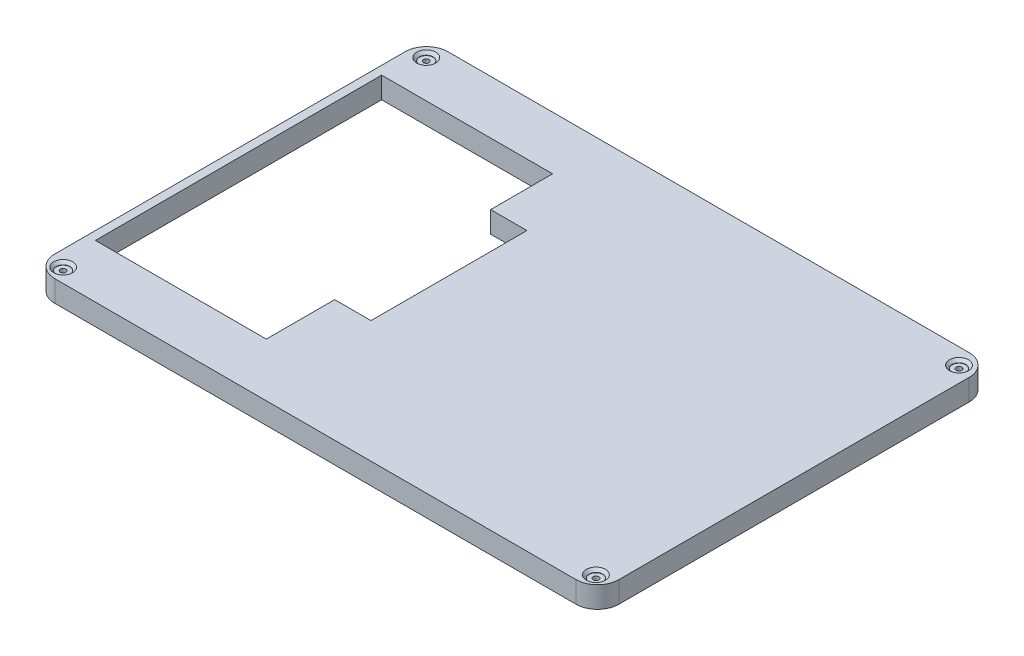
ISO-10303-21;
HEADER;
FILE_DESCRIPTION(('STEP AP214'),'2;1');
FILE_NAME('part.step','',(''),(''),'','','');
FILE_SCHEMA(('AUTOMOTIVE_DESIGN { 1 0 10303 214 1 1 1 1 }'));
ENDSEC;
DATA;
#1=APPLICATION_CONTEXT('core data for automotive mechanical design processes');
#2=APPLICATION_PROTOCOL_DEFINITION('international standard','automotive_design',2000,#1);
#3=PRODUCT_CONTEXT('',#1,'mechanical');
#4=PRODUCT('Part','Part','',(#3));
#5=PRODUCT_RELATED_PRODUCT_CATEGORY('part','',(#4));
#6=PRODUCT_DEFINITION_FORMATION('','',#4);
#7=PRODUCT_DEFINITION_CONTEXT('part definition',#1,'design');
#8=PRODUCT_DEFINITION('design','',#6,#7);
#9=PRODUCT_DEFINITION_SHAPE('','',#8);
#10=(LENGTH_UNIT() NAMED_UNIT(*) SI_UNIT(.MILLI.,.METRE.));
#11=(NAMED_UNIT(*) PLANE_ANGLE_UNIT() SI_UNIT($,.RADIAN.));
#12=(NAMED_UNIT(*) SI_UNIT($,.STERADIAN.) SOLID_ANGLE_UNIT());
#13=UNCERTAINTY_MEASURE_WITH_UNIT(LENGTH_MEASURE(1.E-05),#10,'distance_accuracy_value','');
#14=(GEOMETRIC_REPRESENTATION_CONTEXT(3) GLOBAL_UNCERTAINTY_ASSIGNED_CONTEXT((#13)) GLOBAL_UNIT_ASSIGNED_CONTEXT((#10,
#11,#12)) REPRESENTATION_CONTEXT('',''));
#15=CARTESIAN_POINT('',(0.,0.,0.));
#16=DIRECTION('',(0.,0.,1.));
#17=DIRECTION('',(1.,0.,0.));
#18=AXIS2_PLACEMENT_3D('',#15,#16,#17);
#19=CARTESIAN_POINT('',(-61.,5.,41.));
#20=DIRECTION('',(0.,-1.,0.));
#21=DIRECTION('',(0.,0.,-1.));
#22=AXIS2_PLACEMENT_3D('',#19,#20,#21);
#23=PLANE('',#22);
#24=CARTESIAN_POINT('',(-62.3404075833376,5.,-42.2682833372449));
#25=DIRECTION('',(0.,1.,0.));
#26=DIRECTION('',(0.,0.,1.));
#27=AXIS2_PLACEMENT_3D('',#24,#25,#26);
#28=CIRCLE('',#27,2.2225);
#29=CARTESIAN_POINT('',(-62.3404075833376,5.,-40.0457833372449));
#30=VERTEX_POINT('',#29);
#31=EDGE_CURVE('E489',#30,#30,#28,.T.);
#32=ORIENTED_EDGE('',*,*,#31,.F.);
#33=EDGE_LOOP('',(#32));
#34=FACE_BOUND('',#33,.T.);
#35=CARTESIAN_POINT('',(62.3403524332463,5.,-42.2682833372449));
#36=DIRECTION('',(0.,1.,0.));
#37=DIRECTION('',(0.,0.,1.));
#38=AXIS2_PLACEMENT_3D('',#35,#36,#37);
#39=CIRCLE('',#38,2.2225);
#40=CARTESIAN_POINT('',(62.3403524332463,5.,-40.0457833372449));
#41=VERTEX_POINT('',#40);
#42=EDGE_CURVE('E507',#41,#41,#39,.T.);
#43=ORIENTED_EDGE('',*,*,#42,.F.);
#44=EDGE_LOOP('',(#43));
#45=FACE_BOUND('',#44,.T.);
#46=CARTESIAN_POINT('',(62.3403524332463,5.,42.7012133777981));
#47=DIRECTION('',(0.,1.,0.));
#48=DIRECTION('',(0.,0.,1.));
#49=AXIS2_PLACEMENT_3D('',#46,#47,#48);
#50=CIRCLE('',#49,2.2225);
#51=CARTESIAN_POINT('',(62.3403524332463,5.,44.9237133777981));
#52=VERTEX_POINT('',#51);
#53=EDGE_CURVE('E547',#52,#52,#50,.T.);
#54=ORIENTED_EDGE('',*,*,#53,.F.);
#55=EDGE_LOOP('',(#54));
#56=FACE_BOUND('',#55,.T.);
#57=CARTESIAN_POINT('',(-61.,5.,41.));
#58=DIRECTION('',(0.,1.,0.));
#59=DIRECTION('',(0.,0.,-1.));
#60=AXIS2_PLACEMENT_3D('',#57,#58,#59);
#61=CIRCLE('',#60,5.);
#62=CARTESIAN_POINT('',(-66.,5.,41.));
#63=VERTEX_POINT('',#62);
#64=CARTESIAN_POINT('',(-61.,5.,46.));
#65=VERTEX_POINT('',#64);
#66=EDGE_CURVE('E253',#63,#65,#61,.T.);
#67=ORIENTED_EDGE('',*,*,#66,.T.);
#68=DIRECTION('',(1.,0.,0.));
#69=VECTOR('',#68,1.);
#70=CARTESIAN_POINT('',(-61.,5.,46.));
#71=LINE('',#70,#69);
#72=CARTESIAN_POINT('',(61.,5.,46.));
#73=VERTEX_POINT('',#72);
#74=EDGE_CURVE('E254',#65,#73,#71,.T.);
#75=ORIENTED_EDGE('',*,*,#74,.T.);
#76=CARTESIAN_POINT('',(61.,5.,41.));
#77=DIRECTION('',(0.,1.,0.));
#78=DIRECTION('',(0.,0.,1.));
#79=AXIS2_PLACEMENT_3D('',#76,#77,#78);
#80=CIRCLE('',#79,5.);
#81=CARTESIAN_POINT('',(66.,5.,41.));
#82=VERTEX_POINT('',#81);
#83=EDGE_CURVE('E259',#73,#82,#80,.T.);
#84=ORIENTED_EDGE('',*,*,#83,.T.);
#85=DIRECTION('',(0.,0.,-1.));
#86=VECTOR('',#85,1.);
#87=CARTESIAN_POINT('',(66.,5.,41.));
#88=LINE('',#87,#86);
#89=CARTESIAN_POINT('',(66.,5.,-41.));
#90=VERTEX_POINT('',#89);
#91=EDGE_CURVE('E265',#82,#90,#88,.T.);
#92=ORIENTED_EDGE('',*,*,#91,.T.);
#93=CARTESIAN_POINT('',(61.,5.,-41.));
#94=DIRECTION('',(0.,1.,0.));
#95=DIRECTION('',(0.,0.,-1.));
#96=AXIS2_PLACEMENT_3D('',#93,#94,#95);
#97=CIRCLE('',#96,5.);
#98=CARTESIAN_POINT('',(61.,5.,-46.));
#99=VERTEX_POINT('',#98);
#100=EDGE_CURVE('E264',#90,#99,#97,.T.);
#101=ORIENTED_EDGE('',*,*,#100,.T.);
#102=DIRECTION('',(-1.,0.,0.));
#103=VECTOR('',#102,1.);
#104=CARTESIAN_POINT('',(-61.,5.,-46.));
#105=LINE('',#104,#103);
#106=CARTESIAN_POINT('',(-61.,5.,-46.));
#107=VERTEX_POINT('',#106);
#108=EDGE_CURVE('E268',#99,#107,#105,.T.);
#109=ORIENTED_EDGE('',*,*,#108,.T.);
#110=CARTESIAN_POINT('',(-61.,5.,-41.));
#111=DIRECTION('',(0.,1.,0.));
#112=DIRECTION('',(0.,0.,-1.));
#113=AXIS2_PLACEMENT_3D('',#110,#111,#112);
#114=CIRCLE('',#113,5.);
#115=CARTESIAN_POINT('',(-66.,5.,-41.));
#116=VERTEX_POINT('',#115);
#117=EDGE_CURVE('E271',#107,#116,#114,.T.);
#118=ORIENTED_EDGE('',*,*,#117,.T.);
#119=DIRECTION('',(0.,0.,1.));
#120=VECTOR('',#119,1.);
#121=CARTESIAN_POINT('',(-66.,5.,41.));
#122=LINE('',#121,#120);
#123=EDGE_CURVE('E273',#116,#63,#122,.T.);
#124=ORIENTED_EDGE('',*,*,#123,.T.);
#125=EDGE_LOOP('',(#67,#75,#84,#92,#101,#109,#118,#124));
#126=FACE_BOUND('',#125,.T.);
#127=DIRECTION('',(0.,0.,-1.));
#128=VECTOR('',#127,1.);
#129=CARTESIAN_POINT('',(-24.,5.,-19.));
#130=LINE('',#129,#128);
#131=CARTESIAN_POINT('',(-24.,5.,-19.));
#132=VERTEX_POINT('',#131);
#133=CARTESIAN_POINT('',(-24.,5.,-33.5));
#134=VERTEX_POINT('',#133);
#135=EDGE_CURVE('E157',#132,#134,#130,.T.);
#136=ORIENTED_EDGE('',*,*,#135,.F.);
#137=DIRECTION('',(-1.,0.,0.));
#138=VECTOR('',#137,1.);
#139=CARTESIAN_POINT('',(-24.,5.,-19.));
#140=LINE('',#139,#138);
#141=CARTESIAN_POINT('',(-15.5,5.,-19.));
#142=VERTEX_POINT('',#141);
#143=EDGE_CURVE('E205',#142,#132,#140,.T.);
#144=ORIENTED_EDGE('',*,*,#143,.F.);
#145=DIRECTION('',(0.,0.,-1.));
#146=VECTOR('',#145,1.);
#147=CARTESIAN_POINT('',(-15.5,5.,-19.));
#148=LINE('',#147,#146);
#149=CARTESIAN_POINT('',(-15.5,5.,17.5));
#150=VERTEX_POINT('',#149);
#151=EDGE_CURVE('E200',#150,#142,#148,.T.);
#152=ORIENTED_EDGE('',*,*,#151,.F.);
#153=DIRECTION('',(1.,0.,0.));
#154=VECTOR('',#153,1.);
#155=CARTESIAN_POINT('',(-24.,5.,17.5));
#156=LINE('',#155,#154);
#157=CARTESIAN_POINT('',(-24.,5.,17.5));
#158=VERTEX_POINT('',#157);
#159=EDGE_CURVE('E198',#158,#150,#156,.T.);
#160=ORIENTED_EDGE('',*,*,#159,.F.);
#161=DIRECTION('',(0.,0.,-1.));
#162=VECTOR('',#161,1.);
#163=CARTESIAN_POINT('',(-24.,5.,33.5));
#164=LINE('',#163,#162);
#165=CARTESIAN_POINT('',(-24.,5.,33.5));
#166=VERTEX_POINT('',#165);
#167=EDGE_CURVE('E192',#166,#158,#164,.T.);
#168=ORIENTED_EDGE('',*,*,#167,.F.);
#169=DIRECTION('',(1.,0.,0.));
#170=VECTOR('',#169,1.);
#171=CARTESIAN_POINT('',(-64.,5.,33.5));
#172=LINE('',#171,#170);
#173=CARTESIAN_POINT('',(-64.,5.,33.5));
#174=VERTEX_POINT('',#173);
#175=EDGE_CURVE('E190',#174,#166,#172,.T.);
#176=ORIENTED_EDGE('',*,*,#175,.F.);
#177=DIRECTION('',(0.,0.,1.));
#178=VECTOR('',#177,1.);
#179=CARTESIAN_POINT('',(-64.,5.,33.5));
#180=LINE('',#179,#178);
#181=CARTESIAN_POINT('',(-64.,5.,-33.5));
#182=VERTEX_POINT('',#181);
#183=EDGE_CURVE('E181',#182,#174,#180,.T.);
#184=ORIENTED_EDGE('',*,*,#183,.F.);
#185=DIRECTION('',(-1.,0.,0.));
#186=VECTOR('',#185,1.);
#187=CARTESIAN_POINT('',(-64.,5.,-33.5));
#188=LINE('',#187,#186);
#189=EDGE_CURVE('E169',#134,#182,#188,.T.);
#190=ORIENTED_EDGE('',*,*,#189,.F.);
#191=EDGE_LOOP('',(#136,#144,#152,#160,#168,#176,#184,#190));
#192=FACE_BOUND('',#191,.T.);
#193=CARTESIAN_POINT('',(-62.3404075833376,5.,42.7012133777981));
#194=DIRECTION('',(0.,1.,0.));
#195=DIRECTION('',(0.,0.,1.));
#196=AXIS2_PLACEMENT_3D('',#193,#194,#195);
#197=CIRCLE('',#196,2.2225);
#198=CARTESIAN_POINT('',(-62.3404075833376,5.,44.9237133777981));
#199=VERTEX_POINT('',#198);
#200=EDGE_CURVE('E526',#199,#199,#197,.T.);
#201=ORIENTED_EDGE('',*,*,#200,.F.);
#202=EDGE_LOOP('',(#201));
#203=FACE_BOUND('',#202,.T.);
#204=ADVANCED_FACE('F44',(#34,#45,#56,#126,#192,#203),#23,.F.);
#205=CARTESIAN_POINT('',(-61.,0.,41.));
#206=DIRECTION('',(0.,-1.,0.));
#207=DIRECTION('',(0.,0.,-1.));
#208=AXIS2_PLACEMENT_3D('',#205,#206,#207);
#209=PLANE('',#208);
#210=CARTESIAN_POINT('',(-62.3404075833376,0.,-42.2682833372449));
#211=DIRECTION('',(0.,1.,0.));
#212=DIRECTION('',(0.,0.,1.));
#213=AXIS2_PLACEMENT_3D('',#210,#211,#212);
#214=CIRCLE('',#213,0.660399999999999);
#215=CARTESIAN_POINT('',(-62.3404075833376,0.,-41.6078833372449));
#216=VERTEX_POINT('',#215);
#217=EDGE_CURVE('E501',#216,#216,#214,.T.);
#218=ORIENTED_EDGE('',*,*,#217,.T.);
#219=EDGE_LOOP('',(#218));
#220=FACE_BOUND('',#219,.T.);
#221=CARTESIAN_POINT('',(62.3403524332463,0.,-42.2682833372449));
#222=DIRECTION('',(0.,1.,0.));
#223=DIRECTION('',(0.,0.,1.));
#224=AXIS2_PLACEMENT_3D('',#221,#222,#223);
#225=CIRCLE('',#224,0.660400000000005);
#226=CARTESIAN_POINT('',(62.3403524332463,0.,-41.6078833372449));
#227=VERTEX_POINT('',#226);
#228=EDGE_CURVE('E523',#227,#227,#225,.T.);
#229=ORIENTED_EDGE('',*,*,#228,.T.);
#230=EDGE_LOOP('',(#229));
#231=FACE_BOUND('',#230,.T.);
#232=CARTESIAN_POINT('',(-62.3404075833376,0.,42.7012133777981));
#233=DIRECTION('',(0.,1.,0.));
#234=DIRECTION('',(0.,0.,1.));
#235=AXIS2_PLACEMENT_3D('',#232,#233,#234);
#236=CIRCLE('',#235,0.660399999999999);
#237=CARTESIAN_POINT('',(-62.3404075833376,0.,43.3616133777981));
#238=VERTEX_POINT('',#237);
#239=EDGE_CURVE('E542',#238,#238,#236,.T.);
#240=ORIENTED_EDGE('',*,*,#239,.T.);
#241=EDGE_LOOP('',(#240));
#242=FACE_BOUND('',#241,.T.);
#243=CARTESIAN_POINT('',(62.3403524332463,0.,42.7012133777981));
#244=DIRECTION('',(0.,1.,0.));
#245=DIRECTION('',(0.,0.,1.));
#246=AXIS2_PLACEMENT_3D('',#243,#244,#245);
#247=CIRCLE('',#246,0.660400000000005);
#248=CARTESIAN_POINT('',(62.3403524332463,0.,43.3616133777981));
#249=VERTEX_POINT('',#248);
#250=EDGE_CURVE('E210',#249,#249,#247,.T.);
#251=ORIENTED_EDGE('',*,*,#250,.T.);
#252=EDGE_LOOP('',(#251));
#253=FACE_BOUND('',#252,.T.);
#254=CARTESIAN_POINT('',(-61.,0.,41.));
#255=DIRECTION('',(0.,1.,0.));
#256=DIRECTION('',(0.,0.,-1.));
#257=AXIS2_PLACEMENT_3D('',#254,#255,#256);
#258=CIRCLE('',#257,5.);
#259=CARTESIAN_POINT('',(-66.,0.,41.));
#260=VERTEX_POINT('',#259);
#261=CARTESIAN_POINT('',(-61.,0.,46.));
#262=VERTEX_POINT('',#261);
#263=EDGE_CURVE('E180',#260,#262,#258,.T.);
#264=ORIENTED_EDGE('',*,*,#263,.F.);
#265=DIRECTION('',(0.,0.,1.));
#266=VECTOR('',#265,1.);
#267=CARTESIAN_POINT('',(-66.,0.,41.));
#268=LINE('',#267,#266);
#269=CARTESIAN_POINT('',(-66.,0.,-41.));
#270=VERTEX_POINT('',#269);
#271=EDGE_CURVE('E258',#270,#260,#268,.T.);
#272=ORIENTED_EDGE('',*,*,#271,.F.);
#273=CARTESIAN_POINT('',(-61.,0.,-41.));
#274=DIRECTION('',(0.,1.,0.));
#275=DIRECTION('',(0.,0.,-1.));
#276=AXIS2_PLACEMENT_3D('',#273,#274,#275);
#277=CIRCLE('',#276,5.);
#278=CARTESIAN_POINT('',(-61.,0.,-46.));
#279=VERTEX_POINT('',#278);
#280=EDGE_CURVE('E297',#279,#270,#277,.T.);
#281=ORIENTED_EDGE('',*,*,#280,.F.);
#282=DIRECTION('',(-1.,0.,0.));
#283=VECTOR('',#282,1.);
#284=CARTESIAN_POINT('',(-61.,0.,-46.));
#285=LINE('',#284,#283);
#286=CARTESIAN_POINT('',(61.,0.,-46.));
#287=VERTEX_POINT('',#286);
#288=EDGE_CURVE('E291',#287,#279,#285,.T.);
#289=ORIENTED_EDGE('',*,*,#288,.F.);
#290=CARTESIAN_POINT('',(61.,0.,-41.));
#291=DIRECTION('',(0.,1.,0.));
#292=DIRECTION('',(0.,0.,-1.));
#293=AXIS2_PLACEMENT_3D('',#290,#291,#292);
#294=CIRCLE('',#293,5.);
#295=CARTESIAN_POINT('',(66.,0.,-41.));
#296=VERTEX_POINT('',#295);
#297=EDGE_CURVE('E289',#296,#287,#294,.T.);
#298=ORIENTED_EDGE('',*,*,#297,.F.);
#299=DIRECTION('',(0.,0.,-1.));
#300=VECTOR('',#299,1.);
#301=CARTESIAN_POINT('',(66.,0.,41.));
#302=LINE('',#301,#300);
#303=CARTESIAN_POINT('',(66.,0.,41.));
#304=VERTEX_POINT('',#303);
#305=EDGE_CURVE('E290',#304,#296,#302,.T.);
#306=ORIENTED_EDGE('',*,*,#305,.F.);
#307=CARTESIAN_POINT('',(61.,0.,41.));
#308=DIRECTION('',(0.,1.,0.));
#309=DIRECTION('',(0.,0.,1.));
#310=AXIS2_PLACEMENT_3D('',#307,#308,#309);
#311=CIRCLE('',#310,5.);
#312=CARTESIAN_POINT('',(61.,0.,46.));
#313=VERTEX_POINT('',#312);
#314=EDGE_CURVE('E281',#313,#304,#311,.T.);
#315=ORIENTED_EDGE('',*,*,#314,.F.);
#316=DIRECTION('',(1.,0.,0.));
#317=VECTOR('',#316,1.);
#318=CARTESIAN_POINT('',(-61.,0.,46.));
#319=LINE('',#318,#317);
#320=EDGE_CURVE('E282',#262,#313,#319,.T.);
#321=ORIENTED_EDGE('',*,*,#320,.F.);
#322=EDGE_LOOP('',(#264,#272,#281,#289,#298,#306,#315,#321));
#323=FACE_BOUND('',#322,.T.);
#324=DIRECTION('',(-1.,0.,0.));
#325=VECTOR('',#324,1.);
#326=CARTESIAN_POINT('',(-24.,0.,-19.));
#327=LINE('',#326,#325);
#328=CARTESIAN_POINT('',(-15.5,0.,-19.));
#329=VERTEX_POINT('',#328);
#330=CARTESIAN_POINT('',(-24.,0.,-19.));
#331=VERTEX_POINT('',#330);
#332=EDGE_CURVE('E166',#329,#331,#327,.T.);
#333=ORIENTED_EDGE('',*,*,#332,.T.);
#334=DIRECTION('',(0.,0.,-1.));
#335=VECTOR('',#334,1.);
#336=CARTESIAN_POINT('',(-24.,0.,-19.));
#337=LINE('',#336,#335);
#338=CARTESIAN_POINT('',(-24.,0.,-33.5));
#339=VERTEX_POINT('',#338);
#340=EDGE_CURVE('E68',#331,#339,#337,.T.);
#341=ORIENTED_EDGE('',*,*,#340,.T.);
#342=DIRECTION('',(-1.,0.,0.));
#343=VECTOR('',#342,1.);
#344=CARTESIAN_POINT('',(-64.,0.,-33.5));
#345=LINE('',#344,#343);
#346=CARTESIAN_POINT('',(-64.,0.,-33.5));
#347=VERTEX_POINT('',#346);
#348=EDGE_CURVE('E173',#339,#347,#345,.T.);
#349=ORIENTED_EDGE('',*,*,#348,.T.);
#350=DIRECTION('',(0.,0.,1.));
#351=VECTOR('',#350,1.);
#352=CARTESIAN_POINT('',(-64.,0.,33.5));
#353=LINE('',#352,#351);
#354=CARTESIAN_POINT('',(-64.,0.,33.5));
#355=VERTEX_POINT('',#354);
#356=EDGE_CURVE('E209',#347,#355,#353,.T.);
#357=ORIENTED_EDGE('',*,*,#356,.T.);
#358=DIRECTION('',(1.,0.,0.));
#359=VECTOR('',#358,1.);
#360=CARTESIAN_POINT('',(-64.,0.,33.5));
#361=LINE('',#360,#359);
#362=CARTESIAN_POINT('',(-24.,0.,33.5));
#363=VERTEX_POINT('',#362);
#364=EDGE_CURVE('E212',#355,#363,#361,.T.);
#365=ORIENTED_EDGE('',*,*,#364,.T.);
#366=DIRECTION('',(0.,0.,-1.));
#367=VECTOR('',#366,1.);
#368=CARTESIAN_POINT('',(-24.,0.,33.5));
#369=LINE('',#368,#367);
#370=CARTESIAN_POINT('',(-24.,0.,17.5));
#371=VERTEX_POINT('',#370);
#372=EDGE_CURVE('E217',#363,#371,#369,.T.);
#373=ORIENTED_EDGE('',*,*,#372,.T.);
#374=DIRECTION('',(1.,0.,0.));
#375=VECTOR('',#374,1.);
#376=CARTESIAN_POINT('',(-24.,0.,17.5));
#377=LINE('',#376,#375);
#378=CARTESIAN_POINT('',(-15.5,0.,17.5));
#379=VERTEX_POINT('',#378);
#380=EDGE_CURVE('E225',#371,#379,#377,.T.);
#381=ORIENTED_EDGE('',*,*,#380,.T.);
#382=DIRECTION('',(0.,0.,-1.));
#383=VECTOR('',#382,1.);
#384=CARTESIAN_POINT('',(-15.5,0.,-19.));
#385=LINE('',#384,#383);
#386=EDGE_CURVE('E227',#379,#329,#385,.T.);
#387=ORIENTED_EDGE('',*,*,#386,.T.);
#388=EDGE_LOOP('',(#333,#341,#349,#357,#365,#373,#381,#387));
#389=FACE_BOUND('',#388,.T.);
#390=ADVANCED_FACE('F333',(#220,#231,#242,#253,#323,#389),#209,.T.);
#391=CARTESIAN_POINT('',(-61.,5.,41.));
#392=DIRECTION('',(0.,-1.,0.));
#393=DIRECTION('',(0.,0.,-1.));
#394=AXIS2_PLACEMENT_3D('',#391,#392,#393);
#395=CYLINDRICAL_SURFACE('',#394,5.);
#396=ORIENTED_EDGE('',*,*,#263,.T.);
#397=DIRECTION('',(0.,-1.,0.));
#398=VECTOR('',#397,1.);
#399=CARTESIAN_POINT('',(-61.,5.,46.));
#400=LINE('',#399,#398);
#401=EDGE_CURVE('E11',#65,#262,#400,.T.);
#402=ORIENTED_EDGE('',*,*,#401,.F.);
#403=ORIENTED_EDGE('',*,*,#66,.F.);
#404=DIRECTION('',(0.,-1.,0.));
#405=VECTOR('',#404,1.);
#406=CARTESIAN_POINT('',(-66.,5.,41.));
#407=LINE('',#406,#405);
#408=EDGE_CURVE('E280',#63,#260,#407,.T.);
#409=ORIENTED_EDGE('',*,*,#408,.T.);
#410=EDGE_LOOP('',(#396,#402,#403,#409));
#411=FACE_BOUND('',#410,.T.);
#412=ADVANCED_FACE('F50',(#411),#395,.T.);
#413=CARTESIAN_POINT('',(-61.,5.,46.));
#414=DIRECTION('',(0.,0.,-1.));
#415=DIRECTION('',(-1.,0.,0.));
#416=AXIS2_PLACEMENT_3D('',#413,#414,#415);
#417=PLANE('',#416);
#418=ORIENTED_EDGE('',*,*,#320,.T.);
#419=DIRECTION('',(0.,-1.,0.));
#420=VECTOR('',#419,1.);
#421=CARTESIAN_POINT('',(61.,5.,46.));
#422=LINE('',#421,#420);
#423=EDGE_CURVE('E53',#73,#313,#422,.T.);
#424=ORIENTED_EDGE('',*,*,#423,.F.);
#425=ORIENTED_EDGE('',*,*,#74,.F.);
#426=ORIENTED_EDGE('',*,*,#401,.T.);
#427=EDGE_LOOP('',(#418,#424,#425,#426));
#428=FACE_BOUND('',#427,.T.);
#429=ADVANCED_FACE('F355',(#428),#417,.F.);
#430=CARTESIAN_POINT('',(61.,5.,41.));
#431=DIRECTION('',(0.,-1.,0.));
#432=DIRECTION('',(0.,0.,-1.));
#433=AXIS2_PLACEMENT_3D('',#430,#431,#432);
#434=CYLINDRICAL_SURFACE('',#433,5.);
#435=ORIENTED_EDGE('',*,*,#314,.T.);
#436=DIRECTION('',(0.,-1.,0.));
#437=VECTOR('',#436,1.);
#438=CARTESIAN_POINT('',(66.,5.,41.));
#439=LINE('',#438,#437);
#440=EDGE_CURVE('E319',#82,#304,#439,.T.);
#441=ORIENTED_EDGE('',*,*,#440,.F.);
#442=ORIENTED_EDGE('',*,*,#83,.F.);
#443=ORIENTED_EDGE('',*,*,#423,.T.);
#444=EDGE_LOOP('',(#435,#441,#442,#443));
#445=FACE_BOUND('',#444,.T.);
#446=ADVANCED_FACE('F328',(#445),#434,.T.);
#447=CARTESIAN_POINT('',(66.,5.,41.));
#448=DIRECTION('',(-1.,0.,0.));
#449=DIRECTION('',(0.,0.,1.));
#450=AXIS2_PLACEMENT_3D('',#447,#448,#449);
#451=PLANE('',#450);
#452=ORIENTED_EDGE('',*,*,#305,.T.);
#453=DIRECTION('',(0.,-1.,0.));
#454=VECTOR('',#453,1.);
#455=CARTESIAN_POINT('',(66.,5.,-41.));
#456=LINE('',#455,#454);
#457=EDGE_CURVE('E316',#90,#296,#456,.T.);
#458=ORIENTED_EDGE('',*,*,#457,.F.);
#459=ORIENTED_EDGE('',*,*,#91,.F.);
#460=ORIENTED_EDGE('',*,*,#440,.T.);
#461=EDGE_LOOP('',(#452,#458,#459,#460));
#462=FACE_BOUND('',#461,.T.);
#463=ADVANCED_FACE('F341',(#462),#451,.F.);
#464=CARTESIAN_POINT('',(61.,5.,-41.));
#465=DIRECTION('',(0.,-1.,0.));
#466=DIRECTION('',(0.,0.,-1.));
#467=AXIS2_PLACEMENT_3D('',#464,#465,#466);
#468=CYLINDRICAL_SURFACE('',#467,5.);
#469=ORIENTED_EDGE('',*,*,#297,.T.);
#470=DIRECTION('',(0.,-1.,0.));
#471=VECTOR('',#470,1.);
#472=CARTESIAN_POINT('',(61.,5.,-46.));
#473=LINE('',#472,#471);
#474=EDGE_CURVE('E315',#99,#287,#473,.T.);
#475=ORIENTED_EDGE('',*,*,#474,.F.);
#476=ORIENTED_EDGE('',*,*,#100,.F.);
#477=ORIENTED_EDGE('',*,*,#457,.T.);
#478=EDGE_LOOP('',(#469,#475,#476,#477));
#479=FACE_BOUND('',#478,.T.);
#480=ADVANCED_FACE('F344',(#479),#468,.T.);
#481=CARTESIAN_POINT('',(-61.,5.,-46.));
#482=DIRECTION('',(0.,0.,1.));
#483=DIRECTION('',(1.,0.,0.));
#484=AXIS2_PLACEMENT_3D('',#481,#482,#483);
#485=PLANE('',#484);
#486=ORIENTED_EDGE('',*,*,#288,.T.);
#487=DIRECTION('',(0.,-1.,0.));
#488=VECTOR('',#487,1.);
#489=CARTESIAN_POINT('',(-61.,5.,-46.));
#490=LINE('',#489,#488);
#491=EDGE_CURVE('E306',#107,#279,#490,.T.);
#492=ORIENTED_EDGE('',*,*,#491,.F.);
#493=ORIENTED_EDGE('',*,*,#108,.F.);
#494=ORIENTED_EDGE('',*,*,#474,.T.);
#495=EDGE_LOOP('',(#486,#492,#493,#494));
#496=FACE_BOUND('',#495,.T.);
#497=ADVANCED_FACE('F364',(#496),#485,.F.);
#498=CARTESIAN_POINT('',(-61.,5.,-41.));
#499=DIRECTION('',(0.,-1.,0.));
#500=DIRECTION('',(0.,0.,-1.));
#501=AXIS2_PLACEMENT_3D('',#498,#499,#500);
#502=CYLINDRICAL_SURFACE('',#501,5.);
#503=ORIENTED_EDGE('',*,*,#280,.T.);
#504=DIRECTION('',(0.,-1.,0.));
#505=VECTOR('',#504,1.);
#506=CARTESIAN_POINT('',(-66.,5.,-41.));
#507=LINE('',#506,#505);
#508=EDGE_CURVE('E303',#116,#270,#507,.T.);
#509=ORIENTED_EDGE('',*,*,#508,.F.);
#510=ORIENTED_EDGE('',*,*,#117,.F.);
#511=ORIENTED_EDGE('',*,*,#491,.T.);
#512=EDGE_LOOP('',(#503,#509,#510,#511));
#513=FACE_BOUND('',#512,.T.);
#514=ADVANCED_FACE('F361',(#513),#502,.T.);
#515=CARTESIAN_POINT('',(-66.,5.,41.));
#516=DIRECTION('',(1.,0.,0.));
#517=DIRECTION('',(0.,0.,-1.));
#518=AXIS2_PLACEMENT_3D('',#515,#516,#517);
#519=PLANE('',#518);
#520=ORIENTED_EDGE('',*,*,#271,.T.);
#521=ORIENTED_EDGE('',*,*,#408,.F.);
#522=ORIENTED_EDGE('',*,*,#123,.F.);
#523=ORIENTED_EDGE('',*,*,#508,.T.);
#524=EDGE_LOOP('',(#520,#521,#522,#523));
#525=FACE_BOUND('',#524,.T.);
#526=ADVANCED_FACE('F357',(#525),#519,.F.);
#527=CARTESIAN_POINT('',(-24.,5.,-19.));
#528=DIRECTION('',(-1.,0.,0.));
#529=DIRECTION('',(0.,0.,1.));
#530=AXIS2_PLACEMENT_3D('',#527,#528,#529);
#531=PLANE('',#530);
#532=ORIENTED_EDGE('',*,*,#340,.F.);
#533=DIRECTION('',(0.,-1.,0.));
#534=VECTOR('',#533,1.);
#535=CARTESIAN_POINT('',(-24.,5.,-19.));
#536=LINE('',#535,#534);
#537=EDGE_CURVE('E162',#132,#331,#536,.T.);
#538=ORIENTED_EDGE('',*,*,#537,.F.);
#539=ORIENTED_EDGE('',*,*,#135,.T.);
#540=DIRECTION('',(0.,-1.,0.));
#541=VECTOR('',#540,1.);
#542=CARTESIAN_POINT('',(-24.,5.,-33.5));
#543=LINE('',#542,#541);
#544=EDGE_CURVE('E165',#134,#339,#543,.T.);
#545=ORIENTED_EDGE('',*,*,#544,.T.);
#546=EDGE_LOOP('',(#532,#538,#539,#545));
#547=FACE_BOUND('',#546,.T.);
#548=ADVANCED_FACE('F161',(#547),#531,.T.);
#549=CARTESIAN_POINT('',(-64.,5.,-33.5));
#550=DIRECTION('',(0.,0.,1.));
#551=DIRECTION('',(1.,0.,0.));
#552=AXIS2_PLACEMENT_3D('',#549,#550,#551);
#553=PLANE('',#552);
#554=ORIENTED_EDGE('',*,*,#348,.F.);
#555=ORIENTED_EDGE('',*,*,#544,.F.);
#556=ORIENTED_EDGE('',*,*,#189,.T.);
#557=DIRECTION('',(0.,-1.,0.));
#558=VECTOR('',#557,1.);
#559=CARTESIAN_POINT('',(-64.,5.,-33.5));
#560=LINE('',#559,#558);
#561=EDGE_CURVE('E177',#182,#347,#560,.T.);
#562=ORIENTED_EDGE('',*,*,#561,.T.);
#563=EDGE_LOOP('',(#554,#555,#556,#562));
#564=FACE_BOUND('',#563,.T.);
#565=ADVANCED_FACE('F175',(#564),#553,.T.);
#566=CARTESIAN_POINT('',(-64.,5.,33.5));
#567=DIRECTION('',(1.,0.,0.));
#568=DIRECTION('',(0.,0.,-1.));
#569=AXIS2_PLACEMENT_3D('',#566,#567,#568);
#570=PLANE('',#569);
#571=ORIENTED_EDGE('',*,*,#356,.F.);
#572=ORIENTED_EDGE('',*,*,#561,.F.);
#573=ORIENTED_EDGE('',*,*,#183,.T.);
#574=DIRECTION('',(0.,-1.,0.));
#575=VECTOR('',#574,1.);
#576=CARTESIAN_POINT('',(-64.,5.,33.5));
#577=LINE('',#576,#575);
#578=EDGE_CURVE('E246',#174,#355,#577,.T.);
#579=ORIENTED_EDGE('',*,*,#578,.T.);
#580=EDGE_LOOP('',(#571,#572,#573,#579));
#581=FACE_BOUND('',#580,.T.);
#582=ADVANCED_FACE('F393',(#581),#570,.T.);
#583=CARTESIAN_POINT('',(-64.,5.,33.5));
#584=DIRECTION('',(0.,0.,-1.));
#585=DIRECTION('',(-1.,0.,0.));
#586=AXIS2_PLACEMENT_3D('',#583,#584,#585);
#587=PLANE('',#586);
#588=ORIENTED_EDGE('',*,*,#364,.F.);
#589=ORIENTED_EDGE('',*,*,#578,.F.);
#590=ORIENTED_EDGE('',*,*,#175,.T.);
#591=DIRECTION('',(0.,-1.,0.));
#592=VECTOR('',#591,1.);
#593=CARTESIAN_POINT('',(-24.,5.,33.5));
#594=LINE('',#593,#592);
#595=EDGE_CURVE('E244',#166,#363,#594,.T.);
#596=ORIENTED_EDGE('',*,*,#595,.T.);
#597=EDGE_LOOP('',(#588,#589,#590,#596));
#598=FACE_BOUND('',#597,.T.);
#599=ADVANCED_FACE('F398',(#598),#587,.T.);
#600=CARTESIAN_POINT('',(-24.,5.,33.5));
#601=DIRECTION('',(-1.,0.,0.));
#602=DIRECTION('',(0.,0.,1.));
#603=AXIS2_PLACEMENT_3D('',#600,#601,#602);
#604=PLANE('',#603);
#605=ORIENTED_EDGE('',*,*,#372,.F.);
#606=ORIENTED_EDGE('',*,*,#595,.F.);
#607=ORIENTED_EDGE('',*,*,#167,.T.);
#608=DIRECTION('',(0.,-1.,0.));
#609=VECTOR('',#608,1.);
#610=CARTESIAN_POINT('',(-24.,5.,17.5));
#611=LINE('',#610,#609);
#612=EDGE_CURVE('E238',#158,#371,#611,.T.);
#613=ORIENTED_EDGE('',*,*,#612,.T.);
#614=EDGE_LOOP('',(#605,#606,#607,#613));
#615=FACE_BOUND('',#614,.T.);
#616=ADVANCED_FACE('F403',(#615),#604,.T.);
#617=CARTESIAN_POINT('',(-24.,5.,17.5));
#618=DIRECTION('',(0.,0.,-1.));
#619=DIRECTION('',(-1.,0.,0.));
#620=AXIS2_PLACEMENT_3D('',#617,#618,#619);
#621=PLANE('',#620);
#622=ORIENTED_EDGE('',*,*,#380,.F.);
#623=ORIENTED_EDGE('',*,*,#612,.F.);
#624=ORIENTED_EDGE('',*,*,#159,.T.);
#625=DIRECTION('',(0.,-1.,0.));
#626=VECTOR('',#625,1.);
#627=CARTESIAN_POINT('',(-15.5,5.,17.5));
#628=LINE('',#627,#626);
#629=EDGE_CURVE('E240',#150,#379,#628,.T.);
#630=ORIENTED_EDGE('',*,*,#629,.T.);
#631=EDGE_LOOP('',(#622,#623,#624,#630));
#632=FACE_BOUND('',#631,.T.);
#633=ADVANCED_FACE('F406',(#632),#621,.T.);
#634=CARTESIAN_POINT('',(-15.5,5.,-19.));
#635=DIRECTION('',(-1.,0.,0.));
#636=DIRECTION('',(0.,0.,1.));
#637=AXIS2_PLACEMENT_3D('',#634,#635,#636);
#638=PLANE('',#637);
#639=ORIENTED_EDGE('',*,*,#386,.F.);
#640=ORIENTED_EDGE('',*,*,#629,.F.);
#641=ORIENTED_EDGE('',*,*,#151,.T.);
#642=DIRECTION('',(0.,-1.,0.));
#643=VECTOR('',#642,1.);
#644=CARTESIAN_POINT('',(-15.5,5.,-19.));
#645=LINE('',#644,#643);
#646=EDGE_CURVE('E62',#142,#329,#645,.T.);
#647=ORIENTED_EDGE('',*,*,#646,.T.);
#648=EDGE_LOOP('',(#639,#640,#641,#647));
#649=FACE_BOUND('',#648,.T.);
#650=ADVANCED_FACE('F412',(#649),#638,.T.);
#651=CARTESIAN_POINT('',(-24.,5.,-19.));
#652=DIRECTION('',(0.,0.,1.));
#653=DIRECTION('',(1.,0.,0.));
#654=AXIS2_PLACEMENT_3D('',#651,#652,#653);
#655=PLANE('',#654);
#656=ORIENTED_EDGE('',*,*,#332,.F.);
#657=ORIENTED_EDGE('',*,*,#646,.F.);
#658=ORIENTED_EDGE('',*,*,#143,.T.);
#659=ORIENTED_EDGE('',*,*,#537,.T.);
#660=EDGE_LOOP('',(#656,#657,#658,#659));
#661=FACE_BOUND('',#660,.T.);
#662=ADVANCED_FACE('F417',(#661),#655,.T.);
#663=CARTESIAN_POINT('',(62.3403524332463,5.,42.7012133777981));
#664=DIRECTION('',(0.,1.,0.));
#665=DIRECTION('',(0.,0.,1.));
#666=AXIS2_PLACEMENT_3D('',#663,#664,#665);
#667=CYLINDRICAL_SURFACE('',#666,0.660400000000005);
#668=ORIENTED_EDGE('',*,*,#250,.F.);
#669=EDGE_LOOP('',(#668));
#670=FACE_BOUND('',#669,.T.);
#671=CARTESIAN_POINT('',(62.3403524332463,4.2888,42.7012133777981));
#672=DIRECTION('',(0.,1.,0.));
#673=DIRECTION('',(0.,0.,1.));
#674=AXIS2_PLACEMENT_3D('',#671,#672,#673);
#675=CIRCLE('',#674,0.660400000000005);
#676=CARTESIAN_POINT('',(62.3403524332463,4.2888,43.3616133777981));
#677=VERTEX_POINT('',#676);
#678=EDGE_CURVE('E558',#677,#677,#675,.T.);
#679=ORIENTED_EDGE('',*,*,#678,.T.);
#680=EDGE_LOOP('',(#679));
#681=FACE_BOUND('',#680,.T.);
#682=ADVANCED_FACE('F419',(#670,#681),#667,.F.);
#683=CARTESIAN_POINT('',(63.0007524332463,4.2888,42.7012133777981));
#684=DIRECTION('',(0.,-1.,0.));
#685=DIRECTION('',(0.,0.,-1.));
#686=AXIS2_PLACEMENT_3D('',#683,#684,#685);
#687=PLANE('',#686);
#688=ORIENTED_EDGE('',*,*,#678,.F.);
#689=EDGE_LOOP('',(#688));
#690=FACE_BOUND('',#689,.T.);
#691=CARTESIAN_POINT('',(62.3403524332463,4.2888,42.7012133777981));
#692=DIRECTION('',(0.,1.,0.));
#693=DIRECTION('',(0.,0.,1.));
#694=AXIS2_PLACEMENT_3D('',#691,#692,#693);
#695=CIRCLE('',#694,1.58750000000001);
#696=CARTESIAN_POINT('',(62.3403524332463,4.2888,44.2887133777981));
#697=VERTEX_POINT('',#696);
#698=EDGE_CURVE('E557',#697,#697,#695,.T.);
#699=ORIENTED_EDGE('',*,*,#698,.T.);
#700=EDGE_LOOP('',(#699));
#701=FACE_BOUND('',#700,.T.);
#702=ADVANCED_FACE('F421',(#690,#701),#687,.F.);
#703=CARTESIAN_POINT('',(62.3403524332463,5.,42.7012133777981));
#704=DIRECTION('',(0.,1.,0.));
#705=DIRECTION('',(0.,0.,1.));
#706=AXIS2_PLACEMENT_3D('',#703,#704,#705);
#707=CYLINDRICAL_SURFACE('',#706,1.58750000000001);
#708=ORIENTED_EDGE('',*,*,#698,.F.);
#709=EDGE_LOOP('',(#708));
#710=FACE_BOUND('',#709,.T.);
#711=CARTESIAN_POINT('',(62.3403524332463,4.365,42.7012133777981));
#712=DIRECTION('',(0.,1.,0.));
#713=DIRECTION('',(0.,0.,1.));
#714=AXIS2_PLACEMENT_3D('',#711,#712,#713);
#715=CIRCLE('',#714,1.58750000000001);
#716=CARTESIAN_POINT('',(62.3403524332463,4.365,44.2887133777981));
#717=VERTEX_POINT('',#716);
#718=EDGE_CURVE('E555',#717,#717,#715,.T.);
#719=ORIENTED_EDGE('',*,*,#718,.T.);
#720=EDGE_LOOP('',(#719));
#721=FACE_BOUND('',#720,.T.);
#722=ADVANCED_FACE('F430',(#710,#721),#707,.F.);
#723=CARTESIAN_POINT('',(62.3403524332463,5.,42.7012133777981));
#724=DIRECTION('',(0.,1.,0.));
#725=DIRECTION('',(0.,0.,1.));
#726=AXIS2_PLACEMENT_3D('',#723,#724,#725);
#727=CONICAL_SURFACE('',#726,2.2225,0.785398163397446);
#728=ORIENTED_EDGE('',*,*,#718,.F.);
#729=EDGE_LOOP('',(#728));
#730=FACE_BOUND('',#729,.T.);
#731=ORIENTED_EDGE('',*,*,#53,.T.);
#732=EDGE_LOOP('',(#731));
#733=FACE_BOUND('',#732,.T.);
#734=ADVANCED_FACE('F431',(#730,#733),#727,.F.);
#735=CARTESIAN_POINT('',(-62.3404075833376,5.,42.7012133777981));
#736=DIRECTION('',(0.,1.,0.));
#737=DIRECTION('',(0.,0.,1.));
#738=AXIS2_PLACEMENT_3D('',#735,#736,#737);
#739=CYLINDRICAL_SURFACE('',#738,0.660399999999999);
#740=ORIENTED_EDGE('',*,*,#239,.F.);
#741=EDGE_LOOP('',(#740));
#742=FACE_BOUND('',#741,.T.);
#743=CARTESIAN_POINT('',(-62.3404075833376,4.2888,42.7012133777981));
#744=DIRECTION('',(0.,1.,0.));
#745=DIRECTION('',(0.,0.,1.));
#746=AXIS2_PLACEMENT_3D('',#743,#744,#745);
#747=CIRCLE('',#746,0.660399999999999);
#748=CARTESIAN_POINT('',(-62.3404075833376,4.2888,43.3616133777981));
#749=VERTEX_POINT('',#748);
#750=EDGE_CURVE('E539',#749,#749,#747,.T.);
#751=ORIENTED_EDGE('',*,*,#750,.T.);
#752=EDGE_LOOP('',(#751));
#753=FACE_BOUND('',#752,.T.);
#754=ADVANCED_FACE('F434',(#742,#753),#739,.F.);
#755=CARTESIAN_POINT('',(-61.6800075833376,4.2888,42.7012133777981));
#756=DIRECTION('',(0.,-1.,0.));
#757=DIRECTION('',(0.,0.,-1.));
#758=AXIS2_PLACEMENT_3D('',#755,#756,#757);
#759=PLANE('',#758);
#760=ORIENTED_EDGE('',*,*,#750,.F.);
#761=EDGE_LOOP('',(#760));
#762=FACE_BOUND('',#761,.T.);
#763=CARTESIAN_POINT('',(-62.3404075833376,4.2888,42.7012133777981));
#764=DIRECTION('',(0.,1.,0.));
#765=DIRECTION('',(0.,0.,1.));
#766=AXIS2_PLACEMENT_3D('',#763,#764,#765);
#767=CIRCLE('',#766,1.5875);
#768=CARTESIAN_POINT('',(-62.3404075833376,4.2888,44.2887133777981));
#769=VERTEX_POINT('',#768);
#770=EDGE_CURVE('E536',#769,#769,#767,.T.);
#771=ORIENTED_EDGE('',*,*,#770,.T.);
#772=EDGE_LOOP('',(#771));
#773=FACE_BOUND('',#772,.T.);
#774=ADVANCED_FACE('F438',(#762,#773),#759,.F.);
#775=CARTESIAN_POINT('',(-62.3404075833376,5.,42.7012133777981));
#776=DIRECTION('',(0.,1.,0.));
#777=DIRECTION('',(0.,0.,1.));
#778=AXIS2_PLACEMENT_3D('',#775,#776,#777);
#779=CYLINDRICAL_SURFACE('',#778,1.5875);
#780=ORIENTED_EDGE('',*,*,#770,.F.);
#781=EDGE_LOOP('',(#780));
#782=FACE_BOUND('',#781,.T.);
#783=CARTESIAN_POINT('',(-62.3404075833376,4.365,42.7012133777981));
#784=DIRECTION('',(0.,1.,0.));
#785=DIRECTION('',(0.,0.,1.));
#786=AXIS2_PLACEMENT_3D('',#783,#784,#785);
#787=CIRCLE('',#786,1.5875);
#788=CARTESIAN_POINT('',(-62.3404075833376,4.365,44.2887133777981));
#789=VERTEX_POINT('',#788);
#790=EDGE_CURVE('E535',#789,#789,#787,.T.);
#791=ORIENTED_EDGE('',*,*,#790,.T.);
#792=EDGE_LOOP('',(#791));
#793=FACE_BOUND('',#792,.T.);
#794=ADVANCED_FACE('F444',(#782,#793),#779,.F.);
#795=CARTESIAN_POINT('',(-62.3404075833376,5.,42.7012133777981));
#796=DIRECTION('',(0.,1.,0.));
#797=DIRECTION('',(0.,0.,1.));
#798=AXIS2_PLACEMENT_3D('',#795,#796,#797);
#799=CONICAL_SURFACE('',#798,2.2225,0.785398163397451);
#800=ORIENTED_EDGE('',*,*,#790,.F.);
#801=EDGE_LOOP('',(#800));
#802=FACE_BOUND('',#801,.T.);
#803=ORIENTED_EDGE('',*,*,#200,.T.);
#804=EDGE_LOOP('',(#803));
#805=FACE_BOUND('',#804,.T.);
#806=ADVANCED_FACE('F450',(#802,#805),#799,.F.);
#807=CARTESIAN_POINT('',(62.3403524332463,5.,-42.2682833372449));
#808=DIRECTION('',(0.,1.,0.));
#809=DIRECTION('',(0.,0.,1.));
#810=AXIS2_PLACEMENT_3D('',#807,#808,#809);
#811=CYLINDRICAL_SURFACE('',#810,0.660400000000005);
#812=ORIENTED_EDGE('',*,*,#228,.F.);
#813=EDGE_LOOP('',(#812));
#814=FACE_BOUND('',#813,.T.);
#815=CARTESIAN_POINT('',(62.3403524332463,4.2888,-42.2682833372449));
#816=DIRECTION('',(0.,1.,0.));
#817=DIRECTION('',(0.,0.,1.));
#818=AXIS2_PLACEMENT_3D('',#815,#816,#817);
#819=CIRCLE('',#818,0.660400000000005);
#820=CARTESIAN_POINT('',(62.3403524332463,4.2888,-41.6078833372449));
#821=VERTEX_POINT('',#820);
#822=EDGE_CURVE('E518',#821,#821,#819,.T.);
#823=ORIENTED_EDGE('',*,*,#822,.T.);
#824=EDGE_LOOP('',(#823));
#825=FACE_BOUND('',#824,.T.);
#826=ADVANCED_FACE('F451',(#814,#825),#811,.F.);
#827=CARTESIAN_POINT('',(63.0007524332463,4.2888,-42.2682833372449));
#828=DIRECTION('',(0.,-1.,0.));
#829=DIRECTION('',(0.,0.,-1.));
#830=AXIS2_PLACEMENT_3D('',#827,#828,#829);
#831=PLANE('',#830);
#832=ORIENTED_EDGE('',*,*,#822,.F.);
#833=EDGE_LOOP('',(#832));
#834=FACE_BOUND('',#833,.T.);
#835=CARTESIAN_POINT('',(62.3403524332463,4.2888,-42.2682833372449));
#836=DIRECTION('',(0.,1.,0.));
#837=DIRECTION('',(0.,0.,1.));
#838=AXIS2_PLACEMENT_3D('',#835,#836,#837);
#839=CIRCLE('',#838,1.58750000000001);
#840=CARTESIAN_POINT('',(62.3403524332463,4.2888,-40.6807833372449));
#841=VERTEX_POINT('',#840);
#842=EDGE_CURVE('E517',#841,#841,#839,.T.);
#843=ORIENTED_EDGE('',*,*,#842,.T.);
#844=EDGE_LOOP('',(#843));
#845=FACE_BOUND('',#844,.T.);
#846=ADVANCED_FACE('F454',(#834,#845),#831,.F.);
#847=CARTESIAN_POINT('',(62.3403524332463,5.,-42.2682833372449));
#848=DIRECTION('',(0.,1.,0.));
#849=DIRECTION('',(0.,0.,1.));
#850=AXIS2_PLACEMENT_3D('',#847,#848,#849);
#851=CYLINDRICAL_SURFACE('',#850,1.58750000000001);
#852=ORIENTED_EDGE('',*,*,#842,.F.);
#853=EDGE_LOOP('',(#852));
#854=FACE_BOUND('',#853,.T.);
#855=CARTESIAN_POINT('',(62.3403524332463,4.365,-42.2682833372449));
#856=DIRECTION('',(0.,1.,0.));
#857=DIRECTION('',(0.,0.,1.));
#858=AXIS2_PLACEMENT_3D('',#855,#856,#857);
#859=CIRCLE('',#858,1.58750000000001);
#860=CARTESIAN_POINT('',(62.3403524332463,4.365,-40.6807833372449));
#861=VERTEX_POINT('',#860);
#862=EDGE_CURVE('E515',#861,#861,#859,.T.);
#863=ORIENTED_EDGE('',*,*,#862,.T.);
#864=EDGE_LOOP('',(#863));
#865=FACE_BOUND('',#864,.T.);
#866=ADVANCED_FACE('F459',(#854,#865),#851,.F.);
#867=CARTESIAN_POINT('',(62.3403524332463,5.,-42.2682833372449));
#868=DIRECTION('',(0.,1.,0.));
#869=DIRECTION('',(0.,0.,1.));
#870=AXIS2_PLACEMENT_3D('',#867,#868,#869);
#871=CONICAL_SURFACE('',#870,2.2225,0.785398163397446);
#872=ORIENTED_EDGE('',*,*,#862,.F.);
#873=EDGE_LOOP('',(#872));
#874=FACE_BOUND('',#873,.T.);
#875=ORIENTED_EDGE('',*,*,#42,.T.);
#876=EDGE_LOOP('',(#875));
#877=FACE_BOUND('',#876,.T.);
#878=ADVANCED_FACE('F464',(#874,#877),#871,.F.);
#879=CARTESIAN_POINT('',(-62.3404075833376,5.,-42.2682833372449));
#880=DIRECTION('',(0.,1.,0.));
#881=DIRECTION('',(0.,0.,1.));
#882=AXIS2_PLACEMENT_3D('',#879,#880,#881);
#883=CYLINDRICAL_SURFACE('',#882,0.660399999999999);
#884=ORIENTED_EDGE('',*,*,#217,.F.);
#885=EDGE_LOOP('',(#884));
#886=FACE_BOUND('',#885,.T.);
#887=CARTESIAN_POINT('',(-62.3404075833376,4.2888,-42.2682833372449));
#888=DIRECTION('',(0.,1.,0.));
#889=DIRECTION('',(0.,0.,1.));
#890=AXIS2_PLACEMENT_3D('',#887,#888,#889);
#891=CIRCLE('',#890,0.660399999999999);
#892=CARTESIAN_POINT('',(-62.3404075833376,4.2888,-41.6078833372449));
#893=VERTEX_POINT('',#892);
#894=EDGE_CURVE('E498',#893,#893,#891,.T.);
#895=ORIENTED_EDGE('',*,*,#894,.T.);
#896=EDGE_LOOP('',(#895));
#897=FACE_BOUND('',#896,.T.);
#898=ADVANCED_FACE('F470',(#886,#897),#883,.F.);
#899=CARTESIAN_POINT('',(-61.6800075833376,4.2888,-42.2682833372449));
#900=DIRECTION('',(0.,-1.,0.));
#901=DIRECTION('',(0.,0.,-1.));
#902=AXIS2_PLACEMENT_3D('',#899,#900,#901);
#903=PLANE('',#902);
#904=ORIENTED_EDGE('',*,*,#894,.F.);
#905=EDGE_LOOP('',(#904));
#906=FACE_BOUND('',#905,.T.);
#907=CARTESIAN_POINT('',(-62.3404075833376,4.2888,-42.2682833372449));
#908=DIRECTION('',(0.,1.,0.));
#909=DIRECTION('',(0.,0.,1.));
#910=AXIS2_PLACEMENT_3D('',#907,#908,#909);
#911=CIRCLE('',#910,1.5875);
#912=CARTESIAN_POINT('',(-62.3404075833376,4.2888,-40.6807833372449));
#913=VERTEX_POINT('',#912);
#914=EDGE_CURVE('E493',#913,#913,#911,.T.);
#915=ORIENTED_EDGE('',*,*,#914,.T.);
#916=EDGE_LOOP('',(#915));
#917=FACE_BOUND('',#916,.T.);
#918=ADVANCED_FACE('F473',(#906,#917),#903,.F.);
#919=CARTESIAN_POINT('',(-62.3404075833376,5.,-42.2682833372449));
#920=DIRECTION('',(0.,1.,0.));
#921=DIRECTION('',(0.,0.,1.));
#922=AXIS2_PLACEMENT_3D('',#919,#920,#921);
#923=CYLINDRICAL_SURFACE('',#922,1.5875);
#924=ORIENTED_EDGE('',*,*,#914,.F.);
#925=EDGE_LOOP('',(#924));
#926=FACE_BOUND('',#925,.T.);
#927=CARTESIAN_POINT('',(-62.3404075833376,4.365,-42.2682833372449));
#928=DIRECTION('',(0.,1.,0.));
#929=DIRECTION('',(0.,0.,1.));
#930=AXIS2_PLACEMENT_3D('',#927,#928,#929);
#931=CIRCLE('',#930,1.5875);
#932=CARTESIAN_POINT('',(-62.3404075833376,4.365,-40.6807833372449));
#933=VERTEX_POINT('',#932);
#934=EDGE_CURVE('E488',#933,#933,#931,.T.);
#935=ORIENTED_EDGE('',*,*,#934,.T.);
#936=EDGE_LOOP('',(#935));
#937=FACE_BOUND('',#936,.T.);
#938=ADVANCED_FACE('F474',(#926,#937),#923,.F.);
#939=CARTESIAN_POINT('',(-62.3404075833376,5.,-42.2682833372449));
#940=DIRECTION('',(0.,1.,0.));
#941=DIRECTION('',(0.,0.,1.));
#942=AXIS2_PLACEMENT_3D('',#939,#940,#941);
#943=CONICAL_SURFACE('',#942,2.2225,0.785398163397451);
#944=ORIENTED_EDGE('',*,*,#934,.F.);
#945=EDGE_LOOP('',(#944));
#946=FACE_BOUND('',#945,.T.);
#947=ORIENTED_EDGE('',*,*,#31,.T.);
#948=EDGE_LOOP('',(#947));
#949=FACE_BOUND('',#948,.T.);
#950=ADVANCED_FACE('F479',(#946,#949),#943,.F.);
#951=CLOSED_SHELL('',(#204,#390,#412,#429,#446,#463,#480,#497,#514,#526,#548,#565,#582,#599,
#616,#633,#650,#662,#682,#702,#722,#734,#754,#774,#794,#806,#826,#846,#866,#878,#898,#918,#938,#950));
#952=MANIFOLD_SOLID_BREP('B2',#951);
#953=ADVANCED_BREP_SHAPE_REPRESENTATION('',(#18,#952),#14);
#954=SHAPE_DEFINITION_REPRESENTATION(#9,#953);
ENDSEC;
END-ISO-10303-21;
